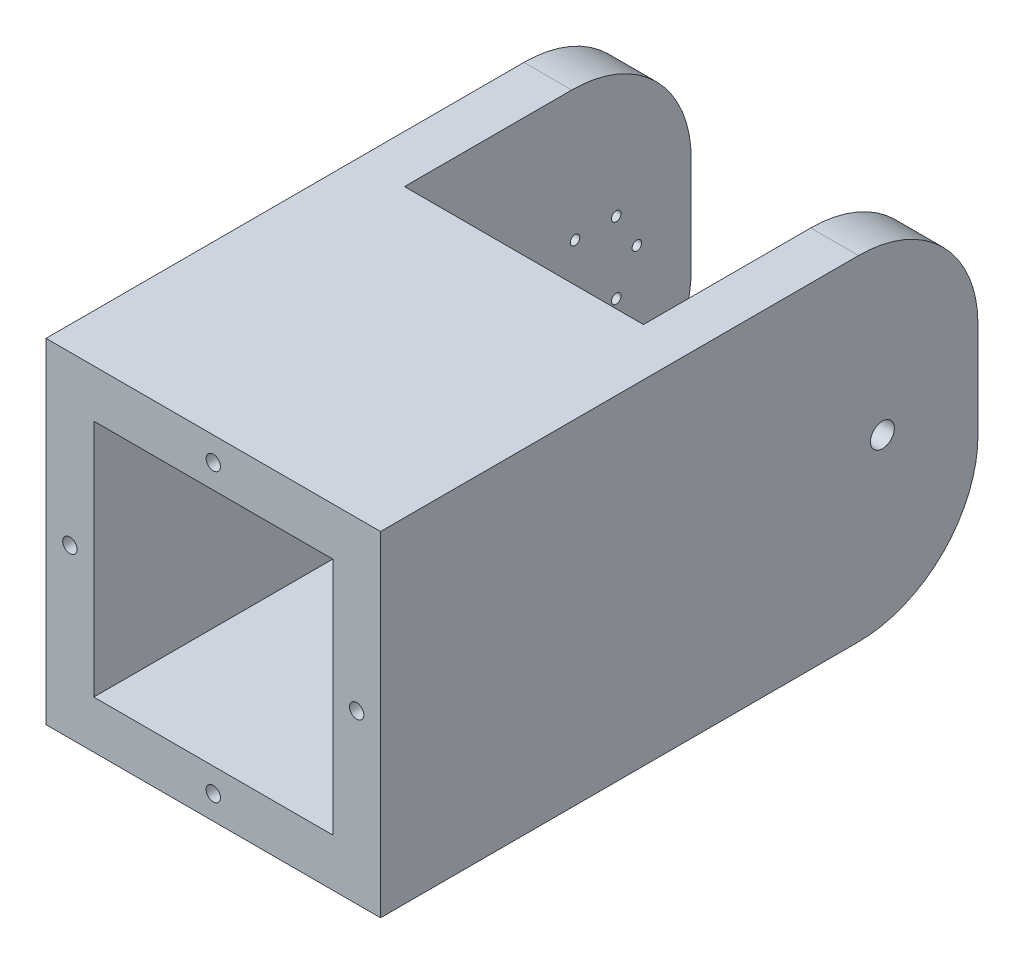
ISO-10303-21;
HEADER;
FILE_DESCRIPTION(('STEP AP214'),'2;1');
FILE_NAME('part.step','',(''),(''),'','','');
FILE_SCHEMA(('AUTOMOTIVE_DESIGN { 1 0 10303 214 1 1 1 1 }'));
ENDSEC;
DATA;
#1=APPLICATION_CONTEXT('core data for automotive mechanical design processes');
#2=APPLICATION_PROTOCOL_DEFINITION('international standard','automotive_design',2000,#1);
#3=PRODUCT_CONTEXT('',#1,'mechanical');
#4=PRODUCT('Part','Part','',(#3));
#5=PRODUCT_RELATED_PRODUCT_CATEGORY('part','',(#4));
#6=PRODUCT_DEFINITION_FORMATION('','',#4);
#7=PRODUCT_DEFINITION_CONTEXT('part definition',#1,'design');
#8=PRODUCT_DEFINITION('design','',#6,#7);
#9=PRODUCT_DEFINITION_SHAPE('','',#8);
#10=(LENGTH_UNIT() NAMED_UNIT(*) SI_UNIT(.MILLI.,.METRE.));
#11=(NAMED_UNIT(*) PLANE_ANGLE_UNIT() SI_UNIT($,.RADIAN.));
#12=(NAMED_UNIT(*) SI_UNIT($,.STERADIAN.) SOLID_ANGLE_UNIT());
#13=UNCERTAINTY_MEASURE_WITH_UNIT(LENGTH_MEASURE(1.E-05),#10,'distance_accuracy_value','');
#14=(GEOMETRIC_REPRESENTATION_CONTEXT(3) GLOBAL_UNCERTAINTY_ASSIGNED_CONTEXT((#13)) GLOBAL_UNIT_ASSIGNED_CONTEXT((#10,
#11,#12)) REPRESENTATION_CONTEXT('',''));
#15=CARTESIAN_POINT('',(0.,0.,0.));
#16=DIRECTION('',(0.,0.,1.));
#17=DIRECTION('',(1.,0.,0.));
#18=AXIS2_PLACEMENT_3D('',#15,#16,#17);
#19=CARTESIAN_POINT('',(0.,0.,0.));
#20=DIRECTION('',(0.,0.,1.));
#21=DIRECTION('',(1.,0.,0.));
#22=AXIS2_PLACEMENT_3D('',#19,#20,#21);
#23=PLANE('',#22);
#24=DIRECTION('',(0.,-1.,0.));
#25=VECTOR('',#24,1.);
#26=CARTESIAN_POINT('',(-197.289473684211,106.657894736842,0.));
#27=LINE('',#26,#25);
#28=CARTESIAN_POINT('',(-197.289473684211,56.6578947368421,0.));
#29=VERTEX_POINT('',#28);
#30=CARTESIAN_POINT('',(-197.289473684211,16.6578947368421,0.));
#31=VERTEX_POINT('',#30);
#32=EDGE_CURVE('E224',#29,#31,#27,.T.);
#33=ORIENTED_EDGE('',*,*,#32,.F.);
#34=DIRECTION('',(-1.,0.,0.));
#35=VECTOR('',#34,1.);
#36=CARTESIAN_POINT('',(0.,56.6578947368422,0.));
#37=LINE('',#36,#35);
#38=CARTESIAN_POINT('',(-177.289473684211,56.6578947368421,0.));
#39=VERTEX_POINT('',#38);
#40=EDGE_CURVE('E270',#29,#39,#37,.F.);
#41=ORIENTED_EDGE('',*,*,#40,.T.);
#42=DIRECTION('',(0.,-1.,0.));
#43=VECTOR('',#42,1.);
#44=CARTESIAN_POINT('',(-177.289473684211,86.6578947368421,0.));
#45=LINE('',#44,#43);
#46=CARTESIAN_POINT('',(-177.289473684211,16.6578947368421,0.));
#47=VERTEX_POINT('',#46);
#48=EDGE_CURVE('E198',#39,#47,#45,.T.);
#49=ORIENTED_EDGE('',*,*,#48,.T.);
#50=DIRECTION('',(1.,0.,0.));
#51=VECTOR('',#50,1.);
#52=CARTESIAN_POINT('',(0.,16.6578947368421,0.));
#53=LINE('',#52,#51);
#54=EDGE_CURVE('E268',#47,#31,#53,.F.);
#55=ORIENTED_EDGE('',*,*,#54,.T.);
#56=EDGE_LOOP('',(#33,#41,#49,#55));
#57=FACE_BOUND('',#56,.T.);
#58=ADVANCED_FACE('F37',(#57),#23,.F.);
#59=CARTESIAN_POINT('',(-177.289473684211,86.6578947368421,250.));
#60=DIRECTION('',(0.,-1.,0.));
#61=DIRECTION('',(1.,0.,0.));
#62=AXIS2_PLACEMENT_3D('',#59,#60,#61);
#63=PLANE('',#62);
#64=DIRECTION('',(0.,0.,-1.));
#65=VECTOR('',#64,1.);
#66=CARTESIAN_POINT('',(-177.289473684211,86.6578947368421,250.));
#67=LINE('',#66,#65);
#68=CARTESIAN_POINT('',(-177.289473684211,86.6578947368421,250.));
#69=VERTEX_POINT('',#68);
#70=CARTESIAN_POINT('',(-177.289473684211,86.6578947368421,120.));
#71=VERTEX_POINT('',#70);
#72=EDGE_CURVE('E214',#69,#71,#67,.T.);
#73=ORIENTED_EDGE('',*,*,#72,.T.);
#74=DIRECTION('',(1.,0.,0.));
#75=VECTOR('',#74,1.);
#76=CARTESIAN_POINT('',(-177.289473684211,86.6578947368421,120.));
#77=LINE('',#76,#75);
#78=CARTESIAN_POINT('',(-77.2894736842105,86.6578947368421,120.));
#79=VERTEX_POINT('',#78);
#80=EDGE_CURVE('E158',#71,#79,#77,.T.);
#81=ORIENTED_EDGE('',*,*,#80,.T.);
#82=DIRECTION('',(0.,0.,-1.));
#83=VECTOR('',#82,1.);
#84=CARTESIAN_POINT('',(-77.2894736842105,86.6578947368421,250.));
#85=LINE('',#84,#83);
#86=CARTESIAN_POINT('',(-77.2894736842105,86.6578947368421,250.));
#87=VERTEX_POINT('',#86);
#88=EDGE_CURVE('E216',#87,#79,#85,.T.);
#89=ORIENTED_EDGE('',*,*,#88,.F.);
#90=DIRECTION('',(-1.,0.,0.));
#91=VECTOR('',#90,1.);
#92=CARTESIAN_POINT('',(-177.289473684211,86.6578947368421,250.));
#93=LINE('',#92,#91);
#94=EDGE_CURVE('E197',#87,#69,#93,.T.);
#95=ORIENTED_EDGE('',*,*,#94,.T.);
#96=EDGE_LOOP('',(#73,#81,#89,#95));
#97=FACE_BOUND('',#96,.T.);
#98=ADVANCED_FACE('F328',(#97),#63,.T.);
#99=CARTESIAN_POINT('',(-177.289473684211,-13.3421052631579,250.));
#100=DIRECTION('',(0.,1.,0.));
#101=DIRECTION('',(-1.,0.,0.));
#102=AXIS2_PLACEMENT_3D('',#99,#100,#101);
#103=PLANE('',#102);
#104=DIRECTION('',(0.,0.,-1.));
#105=VECTOR('',#104,1.);
#106=CARTESIAN_POINT('',(-77.2894736842105,-13.3421052631579,250.));
#107=LINE('',#106,#105);
#108=CARTESIAN_POINT('',(-77.2894736842105,-13.3421052631579,250.));
#109=VERTEX_POINT('',#108);
#110=CARTESIAN_POINT('',(-77.2894736842105,-13.3421052631579,120.));
#111=VERTEX_POINT('',#110);
#112=EDGE_CURVE('E205',#109,#111,#107,.T.);
#113=ORIENTED_EDGE('',*,*,#112,.T.);
#114=DIRECTION('',(-1.,0.,0.));
#115=VECTOR('',#114,1.);
#116=CARTESIAN_POINT('',(-177.289473684211,-13.3421052631579,120.));
#117=LINE('',#116,#115);
#118=CARTESIAN_POINT('',(-177.289473684211,-13.3421052631579,120.));
#119=VERTEX_POINT('',#118);
#120=EDGE_CURVE('E245',#111,#119,#117,.T.);
#121=ORIENTED_EDGE('',*,*,#120,.T.);
#122=DIRECTION('',(0.,0.,-1.));
#123=VECTOR('',#122,1.);
#124=CARTESIAN_POINT('',(-177.289473684211,-13.3421052631579,250.));
#125=LINE('',#124,#123);
#126=CARTESIAN_POINT('',(-177.289473684211,-13.3421052631579,250.));
#127=VERTEX_POINT('',#126);
#128=EDGE_CURVE('E211',#127,#119,#125,.T.);
#129=ORIENTED_EDGE('',*,*,#128,.F.);
#130=DIRECTION('',(1.,0.,0.));
#131=VECTOR('',#130,1.);
#132=CARTESIAN_POINT('',(-177.289473684211,-13.3421052631579,250.));
#133=LINE('',#132,#131);
#134=EDGE_CURVE('E203',#127,#109,#133,.T.);
#135=ORIENTED_EDGE('',*,*,#134,.T.);
#136=EDGE_LOOP('',(#113,#121,#129,#135));
#137=FACE_BOUND('',#136,.T.);
#138=ADVANCED_FACE('F321',(#137),#103,.T.);
#139=CARTESIAN_POINT('',(0.,0.,250.));
#140=DIRECTION('',(0.,0.,1.));
#141=DIRECTION('',(1.,0.,0.));
#142=AXIS2_PLACEMENT_3D('',#139,#140,#141);
#143=PLANE('',#142);
#144=CARTESIAN_POINT('',(-187.289473684211,36.6578947368421,250.));
#145=DIRECTION('',(0.,0.,1.));
#146=DIRECTION('',(1.,0.,0.));
#147=AXIS2_PLACEMENT_3D('',#144,#145,#146);
#148=CIRCLE('',#147,2.99999999999999);
#149=CARTESIAN_POINT('',(-184.289473684211,36.6578947368421,250.));
#150=VERTEX_POINT('',#149);
#151=EDGE_CURVE('E162',#150,#150,#148,.T.);
#152=ORIENTED_EDGE('',*,*,#151,.F.);
#153=EDGE_LOOP('',(#152));
#154=FACE_BOUND('',#153,.T.);
#155=CARTESIAN_POINT('',(-127.28947368421,96.6578947368421,250.));
#156=DIRECTION('',(0.,0.,1.));
#157=DIRECTION('',(1.,0.,0.));
#158=AXIS2_PLACEMENT_3D('',#155,#156,#157);
#159=CIRCLE('',#158,2.99999999999999);
#160=CARTESIAN_POINT('',(-124.28947368421,96.6578947368421,250.));
#161=VERTEX_POINT('',#160);
#162=EDGE_CURVE('E505',#161,#161,#159,.T.);
#163=ORIENTED_EDGE('',*,*,#162,.F.);
#164=EDGE_LOOP('',(#163));
#165=FACE_BOUND('',#164,.T.);
#166=CARTESIAN_POINT('',(-67.2894736842105,36.6578947368417,250.));
#167=DIRECTION('',(0.,0.,1.));
#168=DIRECTION('',(1.,0.,0.));
#169=AXIS2_PLACEMENT_3D('',#166,#167,#168);
#170=CIRCLE('',#169,2.99999999999999);
#171=CARTESIAN_POINT('',(-64.2894736842105,36.6578947368417,250.));
#172=VERTEX_POINT('',#171);
#173=EDGE_CURVE('E487',#172,#172,#170,.T.);
#174=ORIENTED_EDGE('',*,*,#173,.F.);
#175=EDGE_LOOP('',(#174));
#176=FACE_BOUND('',#175,.T.);
#177=CARTESIAN_POINT('',(-127.289473684211,-23.3421052631579,250.));
#178=DIRECTION('',(0.,0.,1.));
#179=DIRECTION('',(1.,0.,0.));
#180=AXIS2_PLACEMENT_3D('',#177,#178,#179);
#181=CIRCLE('',#180,2.99999999999999);
#182=CARTESIAN_POINT('',(-124.289473684211,-23.3421052631579,250.));
#183=VERTEX_POINT('',#182);
#184=EDGE_CURVE('E494',#183,#183,#181,.T.);
#185=ORIENTED_EDGE('',*,*,#184,.F.);
#186=EDGE_LOOP('',(#185));
#187=FACE_BOUND('',#186,.T.);
#188=DIRECTION('',(0.,1.,0.));
#189=VECTOR('',#188,1.);
#190=CARTESIAN_POINT('',(-57.2894736842105,106.657894736842,250.));
#191=LINE('',#190,#189);
#192=CARTESIAN_POINT('',(-57.2894736842105,-33.3421052631579,250.));
#193=VERTEX_POINT('',#192);
#194=CARTESIAN_POINT('',(-57.2894736842105,106.657894736842,250.));
#195=VERTEX_POINT('',#194);
#196=EDGE_CURVE('E220',#193,#195,#191,.T.);
#197=ORIENTED_EDGE('',*,*,#196,.T.);
#198=DIRECTION('',(-1.,0.,0.));
#199=VECTOR('',#198,1.);
#200=CARTESIAN_POINT('',(-197.289473684211,106.657894736842,250.));
#201=LINE('',#200,#199);
#202=CARTESIAN_POINT('',(-197.289473684211,106.657894736842,250.));
#203=VERTEX_POINT('',#202);
#204=EDGE_CURVE('E223',#195,#203,#201,.T.);
#205=ORIENTED_EDGE('',*,*,#204,.T.);
#206=DIRECTION('',(0.,-1.,0.));
#207=VECTOR('',#206,1.);
#208=CARTESIAN_POINT('',(-197.289473684211,106.657894736842,250.));
#209=LINE('',#208,#207);
#210=CARTESIAN_POINT('',(-197.289473684211,-33.3421052631579,250.));
#211=VERTEX_POINT('',#210);
#212=EDGE_CURVE('E226',#203,#211,#209,.T.);
#213=ORIENTED_EDGE('',*,*,#212,.T.);
#214=DIRECTION('',(1.,0.,0.));
#215=VECTOR('',#214,1.);
#216=CARTESIAN_POINT('',(-197.289473684211,-33.3421052631579,250.));
#217=LINE('',#216,#215);
#218=EDGE_CURVE('E228',#211,#193,#217,.T.);
#219=ORIENTED_EDGE('',*,*,#218,.T.);
#220=EDGE_LOOP('',(#197,#205,#213,#219));
#221=FACE_BOUND('',#220,.T.);
#222=ORIENTED_EDGE('',*,*,#94,.F.);
#223=DIRECTION('',(0.,1.,0.));
#224=VECTOR('',#223,1.);
#225=CARTESIAN_POINT('',(-77.2894736842105,86.6578947368421,250.));
#226=LINE('',#225,#224);
#227=EDGE_CURVE('E195',#109,#87,#226,.T.);
#228=ORIENTED_EDGE('',*,*,#227,.F.);
#229=ORIENTED_EDGE('',*,*,#134,.F.);
#230=DIRECTION('',(0.,-1.,0.));
#231=VECTOR('',#230,1.);
#232=CARTESIAN_POINT('',(-177.289473684211,86.6578947368421,250.));
#233=LINE('',#232,#231);
#234=EDGE_CURVE('E200',#69,#127,#233,.T.);
#235=ORIENTED_EDGE('',*,*,#234,.F.);
#236=EDGE_LOOP('',(#222,#228,#229,#235));
#237=FACE_BOUND('',#236,.T.);
#238=ADVANCED_FACE('F290',(#154,#165,#176,#187,#221,#237),#143,.T.);
#239=DIRECTION('',(0.,1.,0.));
#240=VECTOR('',#239,1.);
#241=CARTESIAN_POINT('',(-77.2894736842105,86.6578947368421,0.));
#242=LINE('',#241,#240);
#243=CARTESIAN_POINT('',(-77.2894736842105,16.6578947368421,0.));
#244=VERTEX_POINT('',#243);
#245=CARTESIAN_POINT('',(-77.2894736842105,56.6578947368421,0.));
#246=VERTEX_POINT('',#245);
#247=EDGE_CURVE('E194',#244,#246,#242,.T.);
#248=ORIENTED_EDGE('',*,*,#247,.T.);
#249=DIRECTION('',(-1.,0.,0.));
#250=VECTOR('',#249,1.);
#251=CARTESIAN_POINT('',(0.,56.6578947368422,0.));
#252=LINE('',#251,#250);
#253=CARTESIAN_POINT('',(-57.2894736842105,56.6578947368421,0.));
#254=VERTEX_POINT('',#253);
#255=EDGE_CURVE('E258',#246,#254,#252,.F.);
#256=ORIENTED_EDGE('',*,*,#255,.T.);
#257=DIRECTION('',(0.,1.,0.));
#258=VECTOR('',#257,1.);
#259=CARTESIAN_POINT('',(-57.2894736842105,106.657894736842,0.));
#260=LINE('',#259,#258);
#261=CARTESIAN_POINT('',(-57.2894736842105,16.6578947368421,0.));
#262=VERTEX_POINT('',#261);
#263=EDGE_CURVE('E219',#262,#254,#260,.T.);
#264=ORIENTED_EDGE('',*,*,#263,.F.);
#265=DIRECTION('',(1.,0.,0.));
#266=VECTOR('',#265,1.);
#267=CARTESIAN_POINT('',(0.,16.6578947368421,0.));
#268=LINE('',#267,#266);
#269=EDGE_CURVE('E256',#262,#244,#268,.F.);
#270=ORIENTED_EDGE('',*,*,#269,.T.);
#271=EDGE_LOOP('',(#248,#256,#264,#270));
#272=FACE_BOUND('',#271,.T.);
#273=ADVANCED_FACE('F314',(#272),#23,.F.);
#274=CARTESIAN_POINT('',(-57.2894736842105,106.657894736842,250.));
#275=DIRECTION('',(-1.,0.,0.));
#276=DIRECTION('',(0.,0.,1.));
#277=AXIS2_PLACEMENT_3D('',#274,#275,#276);
#278=PLANE('',#277);
#279=CARTESIAN_POINT('',(-57.2894736842105,36.6578947368421,40.));
#280=DIRECTION('',(-1.,0.,0.));
#281=DIRECTION('',(0.,0.,1.));
#282=AXIS2_PLACEMENT_3D('',#279,#280,#281);
#283=CIRCLE('',#282,5.);
#284=CARTESIAN_POINT('',(-57.2894736842105,36.6578947368421,45.));
#285=VERTEX_POINT('',#284);
#286=EDGE_CURVE('E41',#285,#285,#283,.T.);
#287=ORIENTED_EDGE('',*,*,#286,.T.);
#288=EDGE_LOOP('',(#287));
#289=FACE_BOUND('',#288,.T.);
#290=ORIENTED_EDGE('',*,*,#263,.T.);
#291=CARTESIAN_POINT('',(-57.2894736842105,56.6578947368421,50.));
#292=DIRECTION('',(-1.,0.,0.));
#293=DIRECTION('',(0.,0.,1.));
#294=AXIS2_PLACEMENT_3D('',#291,#292,#293);
#295=CIRCLE('',#294,50.);
#296=CARTESIAN_POINT('',(-57.2894736842105,106.657894736842,50.));
#297=VERTEX_POINT('',#296);
#298=EDGE_CURVE('E262',#254,#297,#295,.F.);
#299=ORIENTED_EDGE('',*,*,#298,.T.);
#300=DIRECTION('',(0.,0.,-1.));
#301=VECTOR('',#300,1.);
#302=CARTESIAN_POINT('',(-57.2894736842105,106.657894736842,250.));
#303=LINE('',#302,#301);
#304=EDGE_CURVE('E243',#195,#297,#303,.T.);
#305=ORIENTED_EDGE('',*,*,#304,.F.);
#306=ORIENTED_EDGE('',*,*,#196,.F.);
#307=DIRECTION('',(0.,0.,-1.));
#308=VECTOR('',#307,1.);
#309=CARTESIAN_POINT('',(-57.2894736842105,-33.3421052631579,250.));
#310=LINE('',#309,#308);
#311=CARTESIAN_POINT('',(-57.2894736842105,-33.3421052631579,50.));
#312=VERTEX_POINT('',#311);
#313=EDGE_CURVE('E230',#193,#312,#310,.T.);
#314=ORIENTED_EDGE('',*,*,#313,.T.);
#315=CARTESIAN_POINT('',(-57.2894736842105,16.6578947368421,50.));
#316=DIRECTION('',(-1.,0.,0.));
#317=DIRECTION('',(0.,0.,1.));
#318=AXIS2_PLACEMENT_3D('',#315,#316,#317);
#319=CIRCLE('',#318,50.);
#320=EDGE_CURVE('E260',#312,#262,#319,.F.);
#321=ORIENTED_EDGE('',*,*,#320,.T.);
#322=EDGE_LOOP('',(#290,#299,#305,#306,#314,#321));
#323=FACE_BOUND('',#322,.T.);
#324=ADVANCED_FACE('F286',(#289,#323),#278,.F.);
#325=CARTESIAN_POINT('',(-197.289473684211,106.657894736842,250.));
#326=DIRECTION('',(0.,-1.,0.));
#327=DIRECTION('',(1.,0.,0.));
#328=AXIS2_PLACEMENT_3D('',#325,#326,#327);
#329=PLANE('',#328);
#330=ORIENTED_EDGE('',*,*,#304,.T.);
#331=DIRECTION('',(-1.,0.,0.));
#332=VECTOR('',#331,1.);
#333=CARTESIAN_POINT('',(-197.289473684211,106.657894736842,50.));
#334=LINE('',#333,#332);
#335=CARTESIAN_POINT('',(-77.2894736842105,106.657894736842,50.));
#336=VERTEX_POINT('',#335);
#337=EDGE_CURVE('E250',#297,#336,#334,.T.);
#338=ORIENTED_EDGE('',*,*,#337,.T.);
#339=DIRECTION('',(0.,0.,-1.));
#340=VECTOR('',#339,1.);
#341=CARTESIAN_POINT('',(-77.2894736842105,106.657894736842,120.));
#342=LINE('',#341,#340);
#343=CARTESIAN_POINT('',(-77.2894736842105,106.657894736842,120.));
#344=VERTEX_POINT('',#343);
#345=EDGE_CURVE('E172',#344,#336,#342,.T.);
#346=ORIENTED_EDGE('',*,*,#345,.F.);
#347=DIRECTION('',(1.,0.,0.));
#348=VECTOR('',#347,1.);
#349=CARTESIAN_POINT('',(-77.2894736842105,106.657894736842,120.));
#350=LINE('',#349,#348);
#351=CARTESIAN_POINT('',(-177.289473684211,106.657894736842,120.));
#352=VERTEX_POINT('',#351);
#353=EDGE_CURVE('E155',#352,#344,#350,.T.);
#354=ORIENTED_EDGE('',*,*,#353,.F.);
#355=DIRECTION('',(0.,0.,-1.));
#356=VECTOR('',#355,1.);
#357=CARTESIAN_POINT('',(-177.289473684211,106.657894736842,120.));
#358=LINE('',#357,#356);
#359=CARTESIAN_POINT('',(-177.289473684211,106.657894736842,50.));
#360=VERTEX_POINT('',#359);
#361=EDGE_CURVE('E165',#352,#360,#358,.T.);
#362=ORIENTED_EDGE('',*,*,#361,.T.);
#363=DIRECTION('',(-1.,0.,0.));
#364=VECTOR('',#363,1.);
#365=CARTESIAN_POINT('',(-197.289473684211,106.657894736842,50.));
#366=LINE('',#365,#364);
#367=CARTESIAN_POINT('',(-197.289473684211,106.657894736842,50.));
#368=VERTEX_POINT('',#367);
#369=EDGE_CURVE('E248',#360,#368,#366,.T.);
#370=ORIENTED_EDGE('',*,*,#369,.T.);
#371=DIRECTION('',(0.,0.,-1.));
#372=VECTOR('',#371,1.);
#373=CARTESIAN_POINT('',(-197.289473684211,106.657894736842,250.));
#374=LINE('',#373,#372);
#375=EDGE_CURVE('E240',#203,#368,#374,.T.);
#376=ORIENTED_EDGE('',*,*,#375,.F.);
#377=ORIENTED_EDGE('',*,*,#204,.F.);
#378=EDGE_LOOP('',(#330,#338,#346,#354,#362,#370,#376,#377));
#379=FACE_BOUND('',#378,.T.);
#380=ADVANCED_FACE('F176',(#379),#329,.F.);
#381=CARTESIAN_POINT('',(-197.289473684211,106.657894736842,250.));
#382=DIRECTION('',(1.,0.,0.));
#383=DIRECTION('',(0.,0.,-1.));
#384=AXIS2_PLACEMENT_3D('',#381,#382,#383);
#385=PLANE('',#384);
#386=CARTESIAN_POINT('',(-197.289473684211,36.6578947368421,22.75));
#387=DIRECTION('',(-1.,0.,0.));
#388=DIRECTION('',(0.,0.,1.));
#389=AXIS2_PLACEMENT_3D('',#386,#387,#388);
#390=CIRCLE('',#389,2.);
#391=CARTESIAN_POINT('',(-197.289473684211,36.6578947368421,24.75));
#392=VERTEX_POINT('',#391);
#393=EDGE_CURVE('E471',#392,#392,#390,.T.);
#394=ORIENTED_EDGE('',*,*,#393,.F.);
#395=EDGE_LOOP('',(#394));
#396=FACE_BOUND('',#395,.T.);
#397=CARTESIAN_POINT('',(-197.289473684211,51.5968329521237,31.375));
#398=DIRECTION('',(-1.,0.,0.));
#399=DIRECTION('',(0.,0.,1.));
#400=AXIS2_PLACEMENT_3D('',#397,#398,#399);
#401=CIRCLE('',#400,2.);
#402=CARTESIAN_POINT('',(-197.289473684211,51.5968329521237,33.375));
#403=VERTEX_POINT('',#402);
#404=EDGE_CURVE('E486',#403,#403,#401,.T.);
#405=ORIENTED_EDGE('',*,*,#404,.F.);
#406=EDGE_LOOP('',(#405));
#407=FACE_BOUND('',#406,.T.);
#408=CARTESIAN_POINT('',(-197.289473684211,51.5968329521236,48.6250000000001));
#409=DIRECTION('',(-1.,0.,0.));
#410=DIRECTION('',(0.,0.,1.));
#411=AXIS2_PLACEMENT_3D('',#408,#409,#410);
#412=CIRCLE('',#411,2.);
#413=CARTESIAN_POINT('',(-197.289473684211,51.5968329521236,50.6250000000001));
#414=VERTEX_POINT('',#413);
#415=EDGE_CURVE('E482',#414,#414,#412,.T.);
#416=ORIENTED_EDGE('',*,*,#415,.F.);
#417=EDGE_LOOP('',(#416));
#418=FACE_BOUND('',#417,.T.);
#419=CARTESIAN_POINT('',(-197.289473684211,36.657894736842,57.25));
#420=DIRECTION('',(-1.,0.,0.));
#421=DIRECTION('',(0.,0.,1.));
#422=AXIS2_PLACEMENT_3D('',#419,#420,#421);
#423=CIRCLE('',#422,2.00000000000001);
#424=CARTESIAN_POINT('',(-197.289473684211,36.657894736842,59.25));
#425=VERTEX_POINT('',#424);
#426=EDGE_CURVE('E478',#425,#425,#423,.T.);
#427=ORIENTED_EDGE('',*,*,#426,.F.);
#428=EDGE_LOOP('',(#427));
#429=FACE_BOUND('',#428,.T.);
#430=CARTESIAN_POINT('',(-197.289473684211,21.7189565215605,48.6249999999999));
#431=DIRECTION('',(-1.,0.,0.));
#432=DIRECTION('',(0.,0.,1.));
#433=AXIS2_PLACEMENT_3D('',#430,#431,#432);
#434=CIRCLE('',#433,2.);
#435=CARTESIAN_POINT('',(-197.289473684211,21.7189565215605,50.6249999999999));
#436=VERTEX_POINT('',#435);
#437=EDGE_CURVE('E468',#436,#436,#434,.T.);
#438=ORIENTED_EDGE('',*,*,#437,.F.);
#439=EDGE_LOOP('',(#438));
#440=FACE_BOUND('',#439,.T.);
#441=CARTESIAN_POINT('',(-197.289473684211,21.7189565215606,31.3749999999998));
#442=DIRECTION('',(-1.,0.,0.));
#443=DIRECTION('',(0.,0.,1.));
#444=AXIS2_PLACEMENT_3D('',#441,#442,#443);
#445=CIRCLE('',#444,2.);
#446=CARTESIAN_POINT('',(-197.289473684211,21.7189565215606,33.3749999999998));
#447=VERTEX_POINT('',#446);
#448=EDGE_CURVE('E467',#447,#447,#445,.T.);
#449=ORIENTED_EDGE('',*,*,#448,.F.);
#450=EDGE_LOOP('',(#449));
#451=FACE_BOUND('',#450,.T.);
#452=ORIENTED_EDGE('',*,*,#375,.T.);
#453=CARTESIAN_POINT('',(-197.289473684211,56.6578947368421,50.));
#454=DIRECTION('',(1.,0.,0.));
#455=DIRECTION('',(0.,0.,-1.));
#456=AXIS2_PLACEMENT_3D('',#453,#454,#455);
#457=CIRCLE('',#456,50.);
#458=EDGE_CURVE('E266',#368,#29,#457,.F.);
#459=ORIENTED_EDGE('',*,*,#458,.T.);
#460=ORIENTED_EDGE('',*,*,#32,.T.);
#461=CARTESIAN_POINT('',(-197.289473684211,16.6578947368421,50.));
#462=DIRECTION('',(1.,0.,0.));
#463=DIRECTION('',(0.,0.,-1.));
#464=AXIS2_PLACEMENT_3D('',#461,#462,#463);
#465=CIRCLE('',#464,50.);
#466=CARTESIAN_POINT('',(-197.289473684211,-33.3421052631579,50.));
#467=VERTEX_POINT('',#466);
#468=EDGE_CURVE('E264',#31,#467,#465,.F.);
#469=ORIENTED_EDGE('',*,*,#468,.T.);
#470=DIRECTION('',(0.,0.,-1.));
#471=VECTOR('',#470,1.);
#472=CARTESIAN_POINT('',(-197.289473684211,-33.3421052631579,250.));
#473=LINE('',#472,#471);
#474=EDGE_CURVE('E237',#211,#467,#473,.T.);
#475=ORIENTED_EDGE('',*,*,#474,.F.);
#476=ORIENTED_EDGE('',*,*,#212,.F.);
#477=EDGE_LOOP('',(#452,#459,#460,#469,#475,#476));
#478=FACE_BOUND('',#477,.T.);
#479=ADVANCED_FACE('F299',(#396,#407,#418,#429,#440,#451,#478),#385,.F.);
#480=CARTESIAN_POINT('',(-197.289473684211,-33.3421052631579,250.));
#481=DIRECTION('',(0.,1.,0.));
#482=DIRECTION('',(0.,0.,1.));
#483=AXIS2_PLACEMENT_3D('',#480,#481,#482);
#484=PLANE('',#483);
#485=ORIENTED_EDGE('',*,*,#474,.T.);
#486=DIRECTION('',(1.,0.,0.));
#487=VECTOR('',#486,1.);
#488=CARTESIAN_POINT('',(-197.289473684211,-33.3421052631579,50.));
#489=LINE('',#488,#487);
#490=CARTESIAN_POINT('',(-177.289473684211,-33.3421052631579,50.));
#491=VERTEX_POINT('',#490);
#492=EDGE_CURVE('E11',#467,#491,#489,.T.);
#493=ORIENTED_EDGE('',*,*,#492,.T.);
#494=DIRECTION('',(0.,0.,-1.));
#495=VECTOR('',#494,1.);
#496=CARTESIAN_POINT('',(-177.289473684211,-33.3421052631579,120.));
#497=LINE('',#496,#495);
#498=CARTESIAN_POINT('',(-177.289473684211,-33.3421052631579,120.));
#499=VERTEX_POINT('',#498);
#500=EDGE_CURVE('E187',#499,#491,#497,.T.);
#501=ORIENTED_EDGE('',*,*,#500,.F.);
#502=DIRECTION('',(-1.,0.,0.));
#503=VECTOR('',#502,1.);
#504=CARTESIAN_POINT('',(-77.2894736842105,-33.3421052631579,120.));
#505=LINE('',#504,#503);
#506=CARTESIAN_POINT('',(-77.2894736842105,-33.3421052631579,120.));
#507=VERTEX_POINT('',#506);
#508=EDGE_CURVE('E173',#507,#499,#505,.T.);
#509=ORIENTED_EDGE('',*,*,#508,.F.);
#510=DIRECTION('',(0.,0.,-1.));
#511=VECTOR('',#510,1.);
#512=CARTESIAN_POINT('',(-77.2894736842105,-33.3421052631579,120.));
#513=LINE('',#512,#511);
#514=CARTESIAN_POINT('',(-77.2894736842105,-33.3421052631579,50.));
#515=VERTEX_POINT('',#514);
#516=EDGE_CURVE('E189',#507,#515,#513,.T.);
#517=ORIENTED_EDGE('',*,*,#516,.T.);
#518=DIRECTION('',(1.,0.,0.));
#519=VECTOR('',#518,1.);
#520=CARTESIAN_POINT('',(-197.289473684211,-33.3421052631579,50.));
#521=LINE('',#520,#519);
#522=EDGE_CURVE('E46',#515,#312,#521,.T.);
#523=ORIENTED_EDGE('',*,*,#522,.T.);
#524=ORIENTED_EDGE('',*,*,#313,.F.);
#525=ORIENTED_EDGE('',*,*,#218,.F.);
#526=EDGE_LOOP('',(#485,#493,#501,#509,#517,#523,#524,#525));
#527=FACE_BOUND('',#526,.T.);
#528=ADVANCED_FACE('F278',(#527),#484,.F.);
#529=CARTESIAN_POINT('',(-77.2894736842105,86.6578947368421,250.));
#530=DIRECTION('',(-1.,0.,0.));
#531=DIRECTION('',(0.,0.,1.));
#532=AXIS2_PLACEMENT_3D('',#529,#530,#531);
#533=PLANE('',#532);
#534=CARTESIAN_POINT('',(-77.2894736842105,36.6578947368421,40.));
#535=DIRECTION('',(-1.,0.,0.));
#536=DIRECTION('',(0.,0.,1.));
#537=AXIS2_PLACEMENT_3D('',#534,#535,#536);
#538=CIRCLE('',#537,22.5);
#539=CARTESIAN_POINT('',(-77.2894736842105,36.6578947368421,62.5));
#540=VERTEX_POINT('',#539);
#541=EDGE_CURVE('E526',#540,#540,#538,.T.);
#542=ORIENTED_EDGE('',*,*,#541,.F.);
#543=EDGE_LOOP('',(#542));
#544=FACE_BOUND('',#543,.T.);
#545=ORIENTED_EDGE('',*,*,#345,.T.);
#546=CARTESIAN_POINT('',(-77.2894736842105,56.6578947368421,50.));
#547=DIRECTION('',(-1.,0.,0.));
#548=DIRECTION('',(0.,0.,1.));
#549=AXIS2_PLACEMENT_3D('',#546,#547,#548);
#550=CIRCLE('',#549,50.);
#551=EDGE_CURVE('E254',#336,#246,#550,.T.);
#552=ORIENTED_EDGE('',*,*,#551,.T.);
#553=ORIENTED_EDGE('',*,*,#247,.F.);
#554=CARTESIAN_POINT('',(-77.2894736842105,16.6578947368421,50.));
#555=DIRECTION('',(-1.,0.,0.));
#556=DIRECTION('',(0.,0.,1.));
#557=AXIS2_PLACEMENT_3D('',#554,#555,#556);
#558=CIRCLE('',#557,50.);
#559=EDGE_CURVE('E252',#244,#515,#558,.T.);
#560=ORIENTED_EDGE('',*,*,#559,.T.);
#561=ORIENTED_EDGE('',*,*,#516,.F.);
#562=DIRECTION('',(0.,-1.,0.));
#563=VECTOR('',#562,1.);
#564=CARTESIAN_POINT('',(-77.2894736842105,106.657894736842,120.));
#565=LINE('',#564,#563);
#566=EDGE_CURVE('E179',#111,#507,#565,.T.);
#567=ORIENTED_EDGE('',*,*,#566,.F.);
#568=ORIENTED_EDGE('',*,*,#112,.F.);
#569=ORIENTED_EDGE('',*,*,#227,.T.);
#570=ORIENTED_EDGE('',*,*,#88,.T.);
#571=EDGE_CURVE('E181',#344,#79,#565,.T.);
#572=ORIENTED_EDGE('',*,*,#571,.F.);
#573=EDGE_LOOP('',(#545,#552,#553,#560,#561,#567,#568,#569,#570,#572));
#574=FACE_BOUND('',#573,.T.);
#575=ADVANCED_FACE('F312',(#544,#574),#533,.T.);
#576=CARTESIAN_POINT('',(-177.289473684211,86.6578947368421,250.));
#577=DIRECTION('',(1.,0.,0.));
#578=DIRECTION('',(0.,0.,-1.));
#579=AXIS2_PLACEMENT_3D('',#576,#577,#578);
#580=PLANE('',#579);
#581=CARTESIAN_POINT('',(-177.289473684211,36.6578947368421,22.75));
#582=DIRECTION('',(-1.,0.,0.));
#583=DIRECTION('',(0.,0.,1.));
#584=AXIS2_PLACEMENT_3D('',#581,#582,#583);
#585=CIRCLE('',#584,2.);
#586=CARTESIAN_POINT('',(-177.289473684211,36.6578947368421,24.75));
#587=VERTEX_POINT('',#586);
#588=EDGE_CURVE('E447',#587,#587,#585,.T.);
#589=ORIENTED_EDGE('',*,*,#588,.T.);
#590=EDGE_LOOP('',(#589));
#591=FACE_BOUND('',#590,.T.);
#592=CARTESIAN_POINT('',(-177.289473684211,51.5968329521237,31.375));
#593=DIRECTION('',(-1.,0.,0.));
#594=DIRECTION('',(0.,0.,1.));
#595=AXIS2_PLACEMENT_3D('',#592,#593,#594);
#596=CIRCLE('',#595,2.);
#597=CARTESIAN_POINT('',(-177.289473684211,51.5968329521237,33.375));
#598=VERTEX_POINT('',#597);
#599=EDGE_CURVE('E451',#598,#598,#596,.T.);
#600=ORIENTED_EDGE('',*,*,#599,.T.);
#601=EDGE_LOOP('',(#600));
#602=FACE_BOUND('',#601,.T.);
#603=CARTESIAN_POINT('',(-177.289473684211,51.5968329521236,48.6250000000001));
#604=DIRECTION('',(-1.,0.,0.));
#605=DIRECTION('',(0.,0.,1.));
#606=AXIS2_PLACEMENT_3D('',#603,#604,#605);
#607=CIRCLE('',#606,2.);
#608=CARTESIAN_POINT('',(-177.289473684211,51.5968329521236,50.6250000000001));
#609=VERTEX_POINT('',#608);
#610=EDGE_CURVE('E455',#609,#609,#607,.T.);
#611=ORIENTED_EDGE('',*,*,#610,.T.);
#612=EDGE_LOOP('',(#611));
#613=FACE_BOUND('',#612,.T.);
#614=CARTESIAN_POINT('',(-177.289473684211,36.657894736842,57.25));
#615=DIRECTION('',(-1.,0.,0.));
#616=DIRECTION('',(0.,0.,1.));
#617=AXIS2_PLACEMENT_3D('',#614,#615,#616);
#618=CIRCLE('',#617,2.00000000000001);
#619=CARTESIAN_POINT('',(-177.289473684211,36.657894736842,59.25));
#620=VERTEX_POINT('',#619);
#621=EDGE_CURVE('E459',#620,#620,#618,.T.);
#622=ORIENTED_EDGE('',*,*,#621,.T.);
#623=EDGE_LOOP('',(#622));
#624=FACE_BOUND('',#623,.T.);
#625=CARTESIAN_POINT('',(-177.289473684211,21.7189565215605,48.6249999999999));
#626=DIRECTION('',(-1.,0.,0.));
#627=DIRECTION('',(0.,0.,1.));
#628=AXIS2_PLACEMENT_3D('',#625,#626,#627);
#629=CIRCLE('',#628,2.);
#630=CARTESIAN_POINT('',(-177.289473684211,21.7189565215605,50.6249999999999));
#631=VERTEX_POINT('',#630);
#632=EDGE_CURVE('E463',#631,#631,#629,.T.);
#633=ORIENTED_EDGE('',*,*,#632,.T.);
#634=EDGE_LOOP('',(#633));
#635=FACE_BOUND('',#634,.T.);
#636=CARTESIAN_POINT('',(-177.289473684211,21.7189565215606,31.3749999999998));
#637=DIRECTION('',(-1.,0.,0.));
#638=DIRECTION('',(0.,0.,1.));
#639=AXIS2_PLACEMENT_3D('',#636,#637,#638);
#640=CIRCLE('',#639,2.);
#641=CARTESIAN_POINT('',(-177.289473684211,21.7189565215606,33.3749999999998));
#642=VERTEX_POINT('',#641);
#643=EDGE_CURVE('E466',#642,#642,#640,.T.);
#644=ORIENTED_EDGE('',*,*,#643,.T.);
#645=EDGE_LOOP('',(#644));
#646=FACE_BOUND('',#645,.T.);
#647=ORIENTED_EDGE('',*,*,#48,.F.);
#648=CARTESIAN_POINT('',(-177.289473684211,56.6578947368421,50.));
#649=DIRECTION('',(1.,0.,0.));
#650=DIRECTION('',(0.,0.,-1.));
#651=AXIS2_PLACEMENT_3D('',#648,#649,#650);
#652=CIRCLE('',#651,50.);
#653=EDGE_CURVE('E168',#39,#360,#652,.T.);
#654=ORIENTED_EDGE('',*,*,#653,.T.);
#655=ORIENTED_EDGE('',*,*,#361,.F.);
#656=DIRECTION('',(0.,1.,0.));
#657=VECTOR('',#656,1.);
#658=CARTESIAN_POINT('',(-177.289473684211,106.657894736842,120.));
#659=LINE('',#658,#657);
#660=EDGE_CURVE('E151',#71,#352,#659,.T.);
#661=ORIENTED_EDGE('',*,*,#660,.F.);
#662=ORIENTED_EDGE('',*,*,#72,.F.);
#663=ORIENTED_EDGE('',*,*,#234,.T.);
#664=ORIENTED_EDGE('',*,*,#128,.T.);
#665=EDGE_CURVE('E161',#499,#119,#659,.T.);
#666=ORIENTED_EDGE('',*,*,#665,.F.);
#667=ORIENTED_EDGE('',*,*,#500,.T.);
#668=CARTESIAN_POINT('',(-177.289473684211,16.6578947368421,50.));
#669=DIRECTION('',(1.,0.,0.));
#670=DIRECTION('',(0.,0.,-1.));
#671=AXIS2_PLACEMENT_3D('',#668,#669,#670);
#672=CIRCLE('',#671,50.);
#673=EDGE_CURVE('E53',#491,#47,#672,.T.);
#674=ORIENTED_EDGE('',*,*,#673,.T.);
#675=EDGE_LOOP('',(#647,#654,#655,#661,#662,#663,#664,#666,#667,#674));
#676=FACE_BOUND('',#675,.T.);
#677=ADVANCED_FACE('F166',(#591,#602,#613,#624,#635,#646,#676),#580,.T.);
#678=CARTESIAN_POINT('',(0.,0.,120.));
#679=DIRECTION('',(0.,0.,-1.));
#680=DIRECTION('',(-1.,0.,0.));
#681=AXIS2_PLACEMENT_3D('',#678,#679,#680);
#682=PLANE('',#681);
#683=ORIENTED_EDGE('',*,*,#566,.T.);
#684=ORIENTED_EDGE('',*,*,#508,.T.);
#685=ORIENTED_EDGE('',*,*,#665,.T.);
#686=ORIENTED_EDGE('',*,*,#120,.F.);
#687=EDGE_LOOP('',(#683,#684,#685,#686));
#688=FACE_BOUND('',#687,.T.);
#689=ADVANCED_FACE('F319',(#688),#682,.T.);
#690=ORIENTED_EDGE('',*,*,#660,.T.);
#691=ORIENTED_EDGE('',*,*,#353,.T.);
#692=ORIENTED_EDGE('',*,*,#571,.T.);
#693=ORIENTED_EDGE('',*,*,#80,.F.);
#694=EDGE_LOOP('',(#690,#691,#692,#693));
#695=FACE_BOUND('',#694,.T.);
#696=ADVANCED_FACE('F153',(#695),#682,.T.);
#697=CARTESIAN_POINT('',(-127.289473684211,-23.3421052631579,240.));
#698=DIRECTION('',(0.,0.,1.));
#699=DIRECTION('',(1.,0.,0.));
#700=AXIS2_PLACEMENT_3D('',#697,#698,#699);
#701=CYLINDRICAL_SURFACE('',#700,2.99999999999999);
#702=CARTESIAN_POINT('',(-127.289473684211,-23.3421052631579,240.));
#703=DIRECTION('',(0.,0.,1.));
#704=DIRECTION('',(1.,0.,0.));
#705=AXIS2_PLACEMENT_3D('',#702,#703,#704);
#706=CIRCLE('',#705,2.99999999999999);
#707=CARTESIAN_POINT('',(-124.289473684211,-23.3421052631579,240.));
#708=VERTEX_POINT('',#707);
#709=EDGE_CURVE('E497',#708,#708,#706,.T.);
#710=ORIENTED_EDGE('',*,*,#709,.F.);
#711=EDGE_LOOP('',(#710));
#712=FACE_BOUND('',#711,.T.);
#713=ORIENTED_EDGE('',*,*,#184,.T.);
#714=EDGE_LOOP('',(#713));
#715=FACE_BOUND('',#714,.T.);
#716=ADVANCED_FACE('F415',(#712,#715),#701,.F.);
#717=CARTESIAN_POINT('',(-127.289473684211,-23.3421052631579,240.));
#718=DIRECTION('',(0.,0.,1.));
#719=DIRECTION('',(1.,0.,0.));
#720=AXIS2_PLACEMENT_3D('',#717,#718,#719);
#721=PLANE('',#720);
#722=ORIENTED_EDGE('',*,*,#709,.T.);
#723=EDGE_LOOP('',(#722));
#724=FACE_BOUND('',#723,.T.);
#725=ADVANCED_FACE('F409',(#724),#721,.T.);
#726=CARTESIAN_POINT('',(-67.2894736842105,36.6578947368417,240.));
#727=DIRECTION('',(0.,0.,1.));
#728=DIRECTION('',(1.,0.,0.));
#729=AXIS2_PLACEMENT_3D('',#726,#727,#728);
#730=CYLINDRICAL_SURFACE('',#729,2.99999999999999);
#731=CARTESIAN_POINT('',(-67.2894736842105,36.6578947368417,240.));
#732=DIRECTION('',(0.,0.,1.));
#733=DIRECTION('',(1.,0.,0.));
#734=AXIS2_PLACEMENT_3D('',#731,#732,#733);
#735=CIRCLE('',#734,2.99999999999999);
#736=CARTESIAN_POINT('',(-64.2894736842105,36.6578947368417,240.));
#737=VERTEX_POINT('',#736);
#738=EDGE_CURVE('E491',#737,#737,#735,.T.);
#739=ORIENTED_EDGE('',*,*,#738,.F.);
#740=EDGE_LOOP('',(#739));
#741=FACE_BOUND('',#740,.T.);
#742=ORIENTED_EDGE('',*,*,#173,.T.);
#743=EDGE_LOOP('',(#742));
#744=FACE_BOUND('',#743,.T.);
#745=ADVANCED_FACE('F405',(#741,#744),#730,.F.);
#746=CARTESIAN_POINT('',(-67.2894736842105,36.6578947368417,240.));
#747=DIRECTION('',(0.,0.,1.));
#748=DIRECTION('',(1.,0.,0.));
#749=AXIS2_PLACEMENT_3D('',#746,#747,#748);
#750=PLANE('',#749);
#751=ORIENTED_EDGE('',*,*,#738,.T.);
#752=EDGE_LOOP('',(#751));
#753=FACE_BOUND('',#752,.T.);
#754=ADVANCED_FACE('F408',(#753),#750,.T.);
#755=CARTESIAN_POINT('',(-127.28947368421,96.6578947368421,240.));
#756=DIRECTION('',(0.,0.,1.));
#757=DIRECTION('',(1.,0.,0.));
#758=AXIS2_PLACEMENT_3D('',#755,#756,#757);
#759=CYLINDRICAL_SURFACE('',#758,2.99999999999999);
#760=CARTESIAN_POINT('',(-127.28947368421,96.6578947368421,240.));
#761=DIRECTION('',(0.,0.,1.));
#762=DIRECTION('',(1.,0.,0.));
#763=AXIS2_PLACEMENT_3D('',#760,#761,#762);
#764=CIRCLE('',#763,2.99999999999999);
#765=CARTESIAN_POINT('',(-124.28947368421,96.6578947368421,240.));
#766=VERTEX_POINT('',#765);
#767=EDGE_CURVE('E490',#766,#766,#764,.T.);
#768=ORIENTED_EDGE('',*,*,#767,.F.);
#769=EDGE_LOOP('',(#768));
#770=FACE_BOUND('',#769,.T.);
#771=ORIENTED_EDGE('',*,*,#162,.T.);
#772=EDGE_LOOP('',(#771));
#773=FACE_BOUND('',#772,.T.);
#774=ADVANCED_FACE('F413',(#770,#773),#759,.F.);
#775=CARTESIAN_POINT('',(-127.28947368421,96.6578947368421,240.));
#776=DIRECTION('',(0.,0.,1.));
#777=DIRECTION('',(1.,0.,0.));
#778=AXIS2_PLACEMENT_3D('',#775,#776,#777);
#779=PLANE('',#778);
#780=ORIENTED_EDGE('',*,*,#767,.T.);
#781=EDGE_LOOP('',(#780));
#782=FACE_BOUND('',#781,.T.);
#783=ADVANCED_FACE('F425',(#782),#779,.T.);
#784=CARTESIAN_POINT('',(-187.289473684211,36.6578947368421,240.));
#785=DIRECTION('',(0.,0.,1.));
#786=DIRECTION('',(1.,0.,0.));
#787=AXIS2_PLACEMENT_3D('',#784,#785,#786);
#788=CYLINDRICAL_SURFACE('',#787,2.99999999999999);
#789=CARTESIAN_POINT('',(-187.289473684211,36.6578947368421,240.));
#790=DIRECTION('',(0.,0.,1.));
#791=DIRECTION('',(1.,0.,0.));
#792=AXIS2_PLACEMENT_3D('',#789,#790,#791);
#793=CIRCLE('',#792,2.99999999999999);
#794=CARTESIAN_POINT('',(-184.289473684211,36.6578947368421,240.));
#795=VERTEX_POINT('',#794);
#796=EDGE_CURVE('E502',#795,#795,#793,.T.);
#797=ORIENTED_EDGE('',*,*,#796,.F.);
#798=EDGE_LOOP('',(#797));
#799=FACE_BOUND('',#798,.T.);
#800=ORIENTED_EDGE('',*,*,#151,.T.);
#801=EDGE_LOOP('',(#800));
#802=FACE_BOUND('',#801,.T.);
#803=ADVANCED_FACE('F422',(#799,#802),#788,.F.);
#804=CARTESIAN_POINT('',(-187.289473684211,36.6578947368421,240.));
#805=DIRECTION('',(0.,0.,1.));
#806=DIRECTION('',(1.,0.,0.));
#807=AXIS2_PLACEMENT_3D('',#804,#805,#806);
#808=PLANE('',#807);
#809=ORIENTED_EDGE('',*,*,#796,.T.);
#810=EDGE_LOOP('',(#809));
#811=FACE_BOUND('',#810,.T.);
#812=ADVANCED_FACE('F393',(#811),#808,.T.);
#813=CARTESIAN_POINT('',(-177.289473684211,21.7189565215606,31.3749999999998));
#814=DIRECTION('',(-1.,0.,0.));
#815=DIRECTION('',(0.,0.,1.));
#816=AXIS2_PLACEMENT_3D('',#813,#814,#815);
#817=CYLINDRICAL_SURFACE('',#816,2.);
#818=ORIENTED_EDGE('',*,*,#643,.F.);
#819=EDGE_LOOP('',(#818));
#820=FACE_BOUND('',#819,.T.);
#821=ORIENTED_EDGE('',*,*,#448,.T.);
#822=EDGE_LOOP('',(#821));
#823=FACE_BOUND('',#822,.T.);
#824=ADVANCED_FACE('F389',(#820,#823),#817,.F.);
#825=CARTESIAN_POINT('',(-177.289473684211,21.7189565215605,48.6249999999999));
#826=DIRECTION('',(-1.,0.,0.));
#827=DIRECTION('',(0.,0.,1.));
#828=AXIS2_PLACEMENT_3D('',#825,#826,#827);
#829=CYLINDRICAL_SURFACE('',#828,2.);
#830=ORIENTED_EDGE('',*,*,#632,.F.);
#831=EDGE_LOOP('',(#830));
#832=FACE_BOUND('',#831,.T.);
#833=ORIENTED_EDGE('',*,*,#437,.T.);
#834=EDGE_LOOP('',(#833));
#835=FACE_BOUND('',#834,.T.);
#836=ADVANCED_FACE('F392',(#832,#835),#829,.F.);
#837=CARTESIAN_POINT('',(-177.289473684211,36.657894736842,57.25));
#838=DIRECTION('',(-1.,0.,0.));
#839=DIRECTION('',(0.,0.,1.));
#840=AXIS2_PLACEMENT_3D('',#837,#838,#839);
#841=CYLINDRICAL_SURFACE('',#840,2.00000000000001);
#842=ORIENTED_EDGE('',*,*,#621,.F.);
#843=EDGE_LOOP('',(#842));
#844=FACE_BOUND('',#843,.T.);
#845=ORIENTED_EDGE('',*,*,#426,.T.);
#846=EDGE_LOOP('',(#845));
#847=FACE_BOUND('',#846,.T.);
#848=ADVANCED_FACE('F397',(#844,#847),#841,.F.);
#849=CARTESIAN_POINT('',(-177.289473684211,51.5968329521236,48.6250000000001));
#850=DIRECTION('',(-1.,0.,0.));
#851=DIRECTION('',(0.,0.,1.));
#852=AXIS2_PLACEMENT_3D('',#849,#850,#851);
#853=CYLINDRICAL_SURFACE('',#852,2.);
#854=ORIENTED_EDGE('',*,*,#610,.F.);
#855=EDGE_LOOP('',(#854));
#856=FACE_BOUND('',#855,.T.);
#857=ORIENTED_EDGE('',*,*,#415,.T.);
#858=EDGE_LOOP('',(#857));
#859=FACE_BOUND('',#858,.T.);
#860=ADVANCED_FACE('F387',(#856,#859),#853,.F.);
#861=CARTESIAN_POINT('',(-177.289473684211,51.5968329521237,31.375));
#862=DIRECTION('',(-1.,0.,0.));
#863=DIRECTION('',(0.,0.,1.));
#864=AXIS2_PLACEMENT_3D('',#861,#862,#863);
#865=CYLINDRICAL_SURFACE('',#864,2.);
#866=ORIENTED_EDGE('',*,*,#599,.F.);
#867=EDGE_LOOP('',(#866));
#868=FACE_BOUND('',#867,.T.);
#869=ORIENTED_EDGE('',*,*,#404,.T.);
#870=EDGE_LOOP('',(#869));
#871=FACE_BOUND('',#870,.T.);
#872=ADVANCED_FACE('F383',(#868,#871),#865,.F.);
#873=CARTESIAN_POINT('',(-177.289473684211,36.6578947368421,22.75));
#874=DIRECTION('',(-1.,0.,0.));
#875=DIRECTION('',(0.,0.,1.));
#876=AXIS2_PLACEMENT_3D('',#873,#874,#875);
#877=CYLINDRICAL_SURFACE('',#876,2.);
#878=ORIENTED_EDGE('',*,*,#588,.F.);
#879=EDGE_LOOP('',(#878));
#880=FACE_BOUND('',#879,.T.);
#881=ORIENTED_EDGE('',*,*,#393,.T.);
#882=EDGE_LOOP('',(#881));
#883=FACE_BOUND('',#882,.T.);
#884=ADVANCED_FACE('F358',(#880,#883),#877,.F.);
#885=CARTESIAN_POINT('',(-197.289473684211,56.6578947368421,50.));
#886=DIRECTION('',(-1.,0.,0.));
#887=DIRECTION('',(0.,-1.,0.));
#888=AXIS2_PLACEMENT_3D('',#885,#886,#887);
#889=CYLINDRICAL_SURFACE('',#888,50.);
#890=ORIENTED_EDGE('',*,*,#298,.F.);
#891=ORIENTED_EDGE('',*,*,#255,.F.);
#892=ORIENTED_EDGE('',*,*,#551,.F.);
#893=ORIENTED_EDGE('',*,*,#337,.F.);
#894=EDGE_LOOP('',(#890,#891,#892,#893));
#895=FACE_BOUND('',#894,.T.);
#896=ADVANCED_FACE('F308',(#895),#889,.T.);
#897=CARTESIAN_POINT('',(-197.289473684211,56.6578947368421,50.));
#898=DIRECTION('',(-1.,0.,0.));
#899=DIRECTION('',(0.,-1.,0.));
#900=AXIS2_PLACEMENT_3D('',#897,#898,#899);
#901=CYLINDRICAL_SURFACE('',#900,50.);
#902=ORIENTED_EDGE('',*,*,#653,.F.);
#903=ORIENTED_EDGE('',*,*,#40,.F.);
#904=ORIENTED_EDGE('',*,*,#458,.F.);
#905=ORIENTED_EDGE('',*,*,#369,.F.);
#906=EDGE_LOOP('',(#902,#903,#904,#905));
#907=FACE_BOUND('',#906,.T.);
#908=ADVANCED_FACE('F304',(#907),#901,.T.);
#909=CARTESIAN_POINT('',(-197.289473684211,16.6578947368421,50.));
#910=DIRECTION('',(1.,0.,0.));
#911=DIRECTION('',(0.,0.,-1.));
#912=AXIS2_PLACEMENT_3D('',#909,#910,#911);
#913=CYLINDRICAL_SURFACE('',#912,50.);
#914=ORIENTED_EDGE('',*,*,#468,.F.);
#915=ORIENTED_EDGE('',*,*,#54,.F.);
#916=ORIENTED_EDGE('',*,*,#673,.F.);
#917=ORIENTED_EDGE('',*,*,#492,.F.);
#918=EDGE_LOOP('',(#914,#915,#916,#917));
#919=FACE_BOUND('',#918,.T.);
#920=ADVANCED_FACE('F298',(#919),#913,.T.);
#921=CARTESIAN_POINT('',(-197.289473684211,16.6578947368421,50.));
#922=DIRECTION('',(1.,0.,0.));
#923=DIRECTION('',(0.,0.,-1.));
#924=AXIS2_PLACEMENT_3D('',#921,#922,#923);
#925=CYLINDRICAL_SURFACE('',#924,50.);
#926=ORIENTED_EDGE('',*,*,#559,.F.);
#927=ORIENTED_EDGE('',*,*,#269,.F.);
#928=ORIENTED_EDGE('',*,*,#320,.F.);
#929=ORIENTED_EDGE('',*,*,#522,.F.);
#930=EDGE_LOOP('',(#926,#927,#928,#929));
#931=FACE_BOUND('',#930,.T.);
#932=ADVANCED_FACE('F39',(#931),#925,.T.);
#933=CARTESIAN_POINT('',(-67.2894736842105,36.6578947368421,40.));
#934=DIRECTION('',(-1.,0.,0.));
#935=DIRECTION('',(0.,0.,1.));
#936=AXIS2_PLACEMENT_3D('',#933,#934,#935);
#937=CYLINDRICAL_SURFACE('',#936,22.5);
#938=CARTESIAN_POINT('',(-67.2894736842105,36.6578947368421,40.));
#939=DIRECTION('',(-1.,0.,0.));
#940=DIRECTION('',(0.,0.,1.));
#941=AXIS2_PLACEMENT_3D('',#938,#939,#940);
#942=CIRCLE('',#941,22.5);
#943=CARTESIAN_POINT('',(-67.2894736842105,36.6578947368421,62.5));
#944=VERTEX_POINT('',#943);
#945=EDGE_CURVE('E530',#944,#944,#942,.T.);
#946=ORIENTED_EDGE('',*,*,#945,.F.);
#947=EDGE_LOOP('',(#946));
#948=FACE_BOUND('',#947,.T.);
#949=ORIENTED_EDGE('',*,*,#541,.T.);
#950=EDGE_LOOP('',(#949));
#951=FACE_BOUND('',#950,.T.);
#952=ADVANCED_FACE('F364',(#948,#951),#937,.F.);
#953=CARTESIAN_POINT('',(-67.2894736842105,36.6578947368421,40.));
#954=DIRECTION('',(-1.,0.,0.));
#955=DIRECTION('',(0.,0.,1.));
#956=AXIS2_PLACEMENT_3D('',#953,#954,#955);
#957=PLANE('',#956);
#958=CARTESIAN_POINT('',(-67.2894736842105,36.6578947368421,40.));
#959=DIRECTION('',(-1.,0.,0.));
#960=DIRECTION('',(0.,0.,1.));
#961=AXIS2_PLACEMENT_3D('',#958,#959,#960);
#962=CIRCLE('',#961,5.);
#963=CARTESIAN_POINT('',(-67.2894736842105,36.6578947368421,45.));
#964=VERTEX_POINT('',#963);
#965=EDGE_CURVE('E535',#964,#964,#962,.T.);
#966=ORIENTED_EDGE('',*,*,#965,.F.);
#967=EDGE_LOOP('',(#966));
#968=FACE_BOUND('',#967,.T.);
#969=ORIENTED_EDGE('',*,*,#945,.T.);
#970=EDGE_LOOP('',(#969));
#971=FACE_BOUND('',#970,.T.);
#972=ADVANCED_FACE('F368',(#968,#971),#957,.T.);
#973=CARTESIAN_POINT('',(-55.2894736842105,36.6578947368421,40.));
#974=DIRECTION('',(-1.,0.,0.));
#975=DIRECTION('',(0.,0.,1.));
#976=AXIS2_PLACEMENT_3D('',#973,#974,#975);
#977=CYLINDRICAL_SURFACE('',#976,5.);
#978=ORIENTED_EDGE('',*,*,#965,.T.);
#979=EDGE_LOOP('',(#978));
#980=FACE_BOUND('',#979,.T.);
#981=ORIENTED_EDGE('',*,*,#286,.F.);
#982=EDGE_LOOP('',(#981));
#983=FACE_BOUND('',#982,.T.);
#984=ADVANCED_FACE('F374',(#980,#983),#977,.F.);
#985=CLOSED_SHELL('',(#58,#98,#138,#238,#273,#324,#380,#479,#528,#575,#677,#689,#696,#716,#725,
#745,#754,#774,#783,#803,#812,#824,#836,#848,#860,#872,#884,#896,#908,#920,#932,#952,#972,#984));
#986=MANIFOLD_SOLID_BREP('B2',#985);
#987=ADVANCED_BREP_SHAPE_REPRESENTATION('',(#18,#986),#14);
#988=SHAPE_DEFINITION_REPRESENTATION(#9,#987);
ENDSEC;
END-ISO-10303-21;
